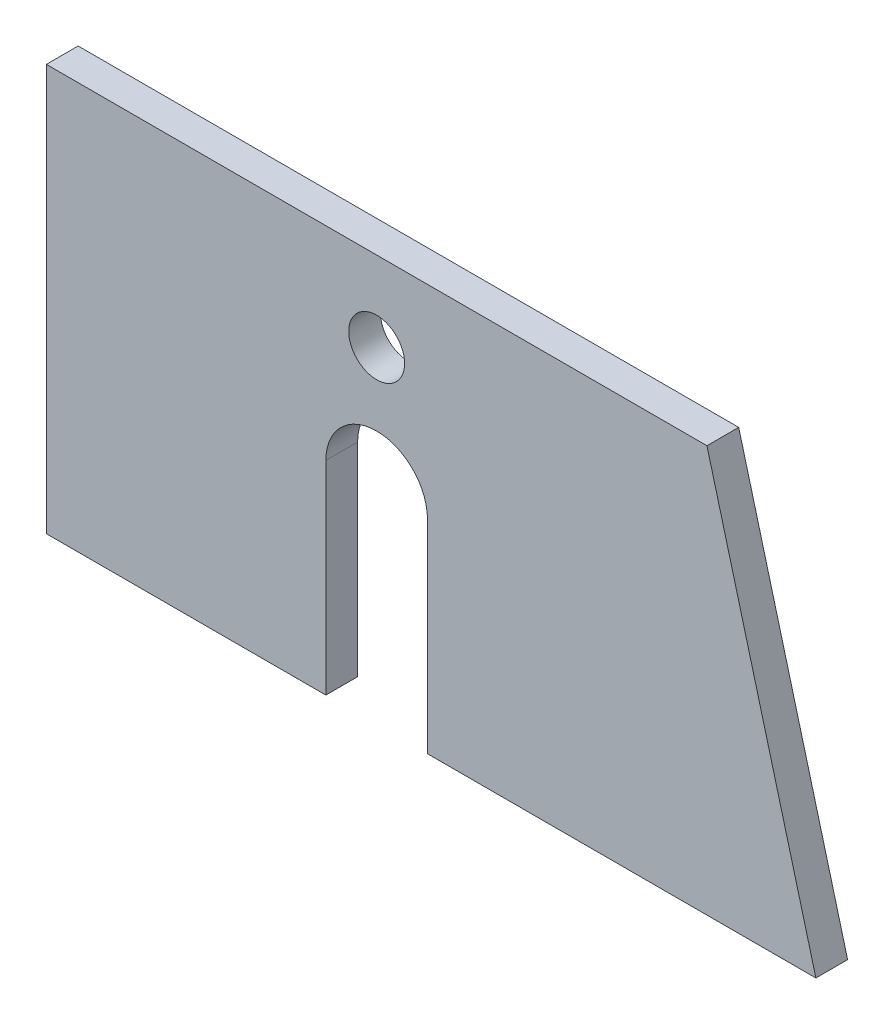
ISO-10303-21;
HEADER;
FILE_DESCRIPTION(('STEP AP214'),'2;1');
FILE_NAME('part.step','',(''),(''),'','','');
FILE_SCHEMA(('AUTOMOTIVE_DESIGN { 1 0 10303 214 1 1 1 1 }'));
ENDSEC;
DATA;
#1=APPLICATION_CONTEXT('core data for automotive mechanical design processes');
#2=APPLICATION_PROTOCOL_DEFINITION('international standard','automotive_design',2000,#1);
#3=PRODUCT_CONTEXT('',#1,'mechanical');
#4=PRODUCT('Part','Part','',(#3));
#5=PRODUCT_RELATED_PRODUCT_CATEGORY('part','',(#4));
#6=PRODUCT_DEFINITION_FORMATION('','',#4);
#7=PRODUCT_DEFINITION_CONTEXT('part definition',#1,'design');
#8=PRODUCT_DEFINITION('design','',#6,#7);
#9=PRODUCT_DEFINITION_SHAPE('','',#8);
#10=(LENGTH_UNIT() NAMED_UNIT(*) SI_UNIT(.MILLI.,.METRE.));
#11=(NAMED_UNIT(*) PLANE_ANGLE_UNIT() SI_UNIT($,.RADIAN.));
#12=(NAMED_UNIT(*) SI_UNIT($,.STERADIAN.) SOLID_ANGLE_UNIT());
#13=UNCERTAINTY_MEASURE_WITH_UNIT(LENGTH_MEASURE(1.E-05),#10,'distance_accuracy_value','');
#14=(GEOMETRIC_REPRESENTATION_CONTEXT(3) GLOBAL_UNCERTAINTY_ASSIGNED_CONTEXT((#13)) GLOBAL_UNIT_ASSIGNED_CONTEXT((#10,
#11,#12)) REPRESENTATION_CONTEXT('',''));
#15=CARTESIAN_POINT('',(0.,0.,0.));
#16=DIRECTION('',(0.,0.,1.));
#17=DIRECTION('',(1.,0.,0.));
#18=AXIS2_PLACEMENT_3D('',#15,#16,#17);
#19=CARTESIAN_POINT('',(0.,0.,3.125));
#20=DIRECTION('',(0.,0.,1.));
#21=DIRECTION('',(1.,0.,0.));
#22=AXIS2_PLACEMENT_3D('',#19,#20,#21);
#23=PLANE('',#22);
#24=DIRECTION('',(0.,-1.,0.));
#25=VECTOR('',#24,1.);
#26=CARTESIAN_POINT('',(-32.5,20.,3.125));
#27=LINE('',#26,#25);
#28=CARTESIAN_POINT('',(-32.5,20.,3.125));
#29=VERTEX_POINT('',#28);
#30=CARTESIAN_POINT('',(-32.5,-20.,3.125));
#31=VERTEX_POINT('',#30);
#32=EDGE_CURVE('E153',#29,#31,#27,.T.);
#33=ORIENTED_EDGE('',*,*,#32,.T.);
#34=DIRECTION('',(1.,0.,0.));
#35=VECTOR('',#34,1.);
#36=CARTESIAN_POINT('',(-32.5,-20.,3.125));
#37=LINE('',#36,#35);
#38=CARTESIAN_POINT('',(-5.,-20.,3.125));
#39=VERTEX_POINT('',#38);
#40=EDGE_CURVE('E101',#31,#39,#37,.T.);
#41=ORIENTED_EDGE('',*,*,#40,.T.);
#42=DIRECTION('',(0.,1.,0.));
#43=VECTOR('',#42,1.);
#44=CARTESIAN_POINT('',(-5.,0.,3.125));
#45=LINE('',#44,#43);
#46=CARTESIAN_POINT('',(-5.,0.,3.125));
#47=VERTEX_POINT('',#46);
#48=EDGE_CURVE('E168',#39,#47,#45,.T.);
#49=ORIENTED_EDGE('',*,*,#48,.T.);
#50=CARTESIAN_POINT('',(0.,0.,3.125));
#51=DIRECTION('',(0.,0.,-1.));
#52=DIRECTION('',(1.,0.,0.));
#53=AXIS2_PLACEMENT_3D('',#50,#51,#52);
#54=CIRCLE('',#53,5.);
#55=CARTESIAN_POINT('',(5.,0.,3.125));
#56=VERTEX_POINT('',#55);
#57=EDGE_CURVE('E181',#47,#56,#54,.T.);
#58=ORIENTED_EDGE('',*,*,#57,.T.);
#59=DIRECTION('',(0.,-1.,0.));
#60=VECTOR('',#59,1.);
#61=CARTESIAN_POINT('',(5.,0.,3.125));
#62=LINE('',#61,#60);
#63=CARTESIAN_POINT('',(5.,-20.,3.125));
#64=VERTEX_POINT('',#63);
#65=EDGE_CURVE('E120',#56,#64,#62,.T.);
#66=ORIENTED_EDGE('',*,*,#65,.T.);
#67=DIRECTION('',(1.,0.,0.));
#68=VECTOR('',#67,1.);
#69=CARTESIAN_POINT('',(5.,-20.,3.125));
#70=LINE('',#69,#68);
#71=CARTESIAN_POINT('',(43.2179676972451,-20.,3.125));
#72=VERTEX_POINT('',#71);
#73=EDGE_CURVE('E114',#64,#72,#70,.T.);
#74=ORIENTED_EDGE('',*,*,#73,.T.);
#75=DIRECTION('',(-0.258819045102525,0.965925826289067,0.));
#76=VECTOR('',#75,1.);
#77=CARTESIAN_POINT('',(32.5,20.,3.125));
#78=LINE('',#77,#76);
#79=CARTESIAN_POINT('',(32.5,20.,3.125));
#80=VERTEX_POINT('',#79);
#81=EDGE_CURVE('E118',#72,#80,#78,.T.);
#82=ORIENTED_EDGE('',*,*,#81,.T.);
#83=DIRECTION('',(-1.,0.,0.));
#84=VECTOR('',#83,1.);
#85=CARTESIAN_POINT('',(-32.5,20.,3.125));
#86=LINE('',#85,#84);
#87=EDGE_CURVE('E58',#80,#29,#86,.T.);
#88=ORIENTED_EDGE('',*,*,#87,.T.);
#89=EDGE_LOOP('',(#33,#41,#49,#58,#66,#74,#82,#88));
#90=FACE_BOUND('',#89,.T.);
#91=CARTESIAN_POINT('',(0.,12.125,3.125));
#92=DIRECTION('',(0.,0.,1.));
#93=DIRECTION('',(1.,0.,0.));
#94=AXIS2_PLACEMENT_3D('',#91,#92,#93);
#95=CIRCLE('',#94,2.75);
#96=CARTESIAN_POINT('',(2.75,12.125,3.125));
#97=VERTEX_POINT('',#96);
#98=EDGE_CURVE('E142',#97,#97,#95,.T.);
#99=ORIENTED_EDGE('',*,*,#98,.F.);
#100=EDGE_LOOP('',(#99));
#101=FACE_BOUND('',#100,.T.);
#102=ADVANCED_FACE('F41',(#90,#101),#23,.T.);
#103=CARTESIAN_POINT('',(0.,0.,0.));
#104=DIRECTION('',(0.,0.,1.));
#105=DIRECTION('',(1.,0.,0.));
#106=AXIS2_PLACEMENT_3D('',#103,#104,#105);
#107=PLANE('',#106);
#108=DIRECTION('',(0.,-1.,0.));
#109=VECTOR('',#108,1.);
#110=CARTESIAN_POINT('',(-32.5,20.,0.));
#111=LINE('',#110,#109);
#112=CARTESIAN_POINT('',(-32.5,20.,0.));
#113=VERTEX_POINT('',#112);
#114=CARTESIAN_POINT('',(-32.5,-20.,0.));
#115=VERTEX_POINT('',#114);
#116=EDGE_CURVE('E138',#113,#115,#111,.T.);
#117=ORIENTED_EDGE('',*,*,#116,.F.);
#118=DIRECTION('',(-1.,0.,0.));
#119=VECTOR('',#118,1.);
#120=CARTESIAN_POINT('',(-32.5,20.,0.));
#121=LINE('',#120,#119);
#122=CARTESIAN_POINT('',(32.5,20.,0.));
#123=VERTEX_POINT('',#122);
#124=EDGE_CURVE('E93',#123,#113,#121,.T.);
#125=ORIENTED_EDGE('',*,*,#124,.F.);
#126=DIRECTION('',(-0.258819045102525,0.965925826289067,0.));
#127=VECTOR('',#126,1.);
#128=CARTESIAN_POINT('',(32.5,20.,0.));
#129=LINE('',#128,#127);
#130=CARTESIAN_POINT('',(43.2179676972451,-20.,0.));
#131=VERTEX_POINT('',#130);
#132=EDGE_CURVE('E87',#131,#123,#129,.T.);
#133=ORIENTED_EDGE('',*,*,#132,.F.);
#134=DIRECTION('',(1.,0.,0.));
#135=VECTOR('',#134,1.);
#136=CARTESIAN_POINT('',(5.,-20.,0.));
#137=LINE('',#136,#135);
#138=CARTESIAN_POINT('',(5.,-20.,0.));
#139=VERTEX_POINT('',#138);
#140=EDGE_CURVE('E128',#139,#131,#137,.T.);
#141=ORIENTED_EDGE('',*,*,#140,.F.);
#142=DIRECTION('',(0.,-1.,0.));
#143=VECTOR('',#142,1.);
#144=CARTESIAN_POINT('',(5.,0.,0.));
#145=LINE('',#144,#143);
#146=CARTESIAN_POINT('',(5.,0.,0.));
#147=VERTEX_POINT('',#146);
#148=EDGE_CURVE('E148',#147,#139,#145,.T.);
#149=ORIENTED_EDGE('',*,*,#148,.F.);
#150=CARTESIAN_POINT('',(0.,0.,0.));
#151=DIRECTION('',(0.,0.,-1.));
#152=DIRECTION('',(1.,0.,0.));
#153=AXIS2_PLACEMENT_3D('',#150,#151,#152);
#154=CIRCLE('',#153,5.);
#155=CARTESIAN_POINT('',(-5.,0.,0.));
#156=VERTEX_POINT('',#155);
#157=EDGE_CURVE('E146',#156,#147,#154,.T.);
#158=ORIENTED_EDGE('',*,*,#157,.F.);
#159=DIRECTION('',(0.,1.,0.));
#160=VECTOR('',#159,1.);
#161=CARTESIAN_POINT('',(-5.,0.,0.));
#162=LINE('',#161,#160);
#163=CARTESIAN_POINT('',(-5.,-20.,0.));
#164=VERTEX_POINT('',#163);
#165=EDGE_CURVE('E144',#164,#156,#162,.T.);
#166=ORIENTED_EDGE('',*,*,#165,.F.);
#167=DIRECTION('',(1.,0.,0.));
#168=VECTOR('',#167,1.);
#169=CARTESIAN_POINT('',(-32.5,-20.,0.));
#170=LINE('',#169,#168);
#171=EDGE_CURVE('E141',#115,#164,#170,.T.);
#172=ORIENTED_EDGE('',*,*,#171,.F.);
#173=EDGE_LOOP('',(#117,#125,#133,#141,#149,#158,#166,#172));
#174=FACE_BOUND('',#173,.T.);
#175=CARTESIAN_POINT('',(0.,12.125,0.));
#176=DIRECTION('',(0.,0.,1.));
#177=DIRECTION('',(1.,0.,0.));
#178=AXIS2_PLACEMENT_3D('',#175,#176,#177);
#179=CIRCLE('',#178,2.75);
#180=CARTESIAN_POINT('',(2.75,12.125,0.));
#181=VERTEX_POINT('',#180);
#182=EDGE_CURVE('E187',#181,#181,#179,.T.);
#183=ORIENTED_EDGE('',*,*,#182,.T.);
#184=EDGE_LOOP('',(#183));
#185=FACE_BOUND('',#184,.T.);
#186=ADVANCED_FACE('F172',(#174,#185),#107,.F.);
#187=CARTESIAN_POINT('',(-32.5,20.,3.125));
#188=DIRECTION('',(1.,0.,0.));
#189=DIRECTION('',(0.,1.,0.));
#190=AXIS2_PLACEMENT_3D('',#187,#188,#189);
#191=PLANE('',#190);
#192=ORIENTED_EDGE('',*,*,#116,.T.);
#193=DIRECTION('',(0.,0.,-1.));
#194=VECTOR('',#193,1.);
#195=CARTESIAN_POINT('',(-32.5,-20.,3.125));
#196=LINE('',#195,#194);
#197=EDGE_CURVE('E11',#31,#115,#196,.T.);
#198=ORIENTED_EDGE('',*,*,#197,.F.);
#199=ORIENTED_EDGE('',*,*,#32,.F.);
#200=DIRECTION('',(0.,0.,-1.));
#201=VECTOR('',#200,1.);
#202=CARTESIAN_POINT('',(-32.5,20.,3.125));
#203=LINE('',#202,#201);
#204=EDGE_CURVE('E134',#29,#113,#203,.T.);
#205=ORIENTED_EDGE('',*,*,#204,.T.);
#206=EDGE_LOOP('',(#192,#198,#199,#205));
#207=FACE_BOUND('',#206,.T.);
#208=ADVANCED_FACE('F43',(#207),#191,.F.);
#209=CARTESIAN_POINT('',(-32.5,-20.,3.125));
#210=DIRECTION('',(0.,1.,0.));
#211=DIRECTION('',(-1.,0.,0.));
#212=AXIS2_PLACEMENT_3D('',#209,#210,#211);
#213=PLANE('',#212);
#214=ORIENTED_EDGE('',*,*,#171,.T.);
#215=DIRECTION('',(0.,0.,-1.));
#216=VECTOR('',#215,1.);
#217=CARTESIAN_POINT('',(-5.,-20.,3.125));
#218=LINE('',#217,#216);
#219=EDGE_CURVE('E50',#39,#164,#218,.T.);
#220=ORIENTED_EDGE('',*,*,#219,.F.);
#221=ORIENTED_EDGE('',*,*,#40,.F.);
#222=ORIENTED_EDGE('',*,*,#197,.T.);
#223=EDGE_LOOP('',(#214,#220,#221,#222));
#224=FACE_BOUND('',#223,.T.);
#225=ADVANCED_FACE('F215',(#224),#213,.F.);
#226=CARTESIAN_POINT('',(-5.,0.,3.125));
#227=DIRECTION('',(-1.,0.,0.));
#228=DIRECTION('',(0.,-1.,0.));
#229=AXIS2_PLACEMENT_3D('',#226,#227,#228);
#230=PLANE('',#229);
#231=ORIENTED_EDGE('',*,*,#165,.T.);
#232=DIRECTION('',(0.,0.,-1.));
#233=VECTOR('',#232,1.);
#234=CARTESIAN_POINT('',(-5.,0.,3.125));
#235=LINE('',#234,#233);
#236=EDGE_CURVE('E160',#47,#156,#235,.T.);
#237=ORIENTED_EDGE('',*,*,#236,.F.);
#238=ORIENTED_EDGE('',*,*,#48,.F.);
#239=ORIENTED_EDGE('',*,*,#219,.T.);
#240=EDGE_LOOP('',(#231,#237,#238,#239));
#241=FACE_BOUND('',#240,.T.);
#242=ADVANCED_FACE('F166',(#241),#230,.F.);
#243=CARTESIAN_POINT('',(0.,0.,3.125));
#244=DIRECTION('',(0.,0.,-1.));
#245=DIRECTION('',(-1.,0.,0.));
#246=AXIS2_PLACEMENT_3D('',#243,#244,#245);
#247=CYLINDRICAL_SURFACE('',#246,5.);
#248=ORIENTED_EDGE('',*,*,#157,.T.);
#249=DIRECTION('',(0.,0.,-1.));
#250=VECTOR('',#249,1.);
#251=CARTESIAN_POINT('',(5.,0.,3.125));
#252=LINE('',#251,#250);
#253=EDGE_CURVE('E157',#56,#147,#252,.T.);
#254=ORIENTED_EDGE('',*,*,#253,.F.);
#255=ORIENTED_EDGE('',*,*,#57,.F.);
#256=ORIENTED_EDGE('',*,*,#236,.T.);
#257=EDGE_LOOP('',(#248,#254,#255,#256));
#258=FACE_BOUND('',#257,.T.);
#259=ADVANCED_FACE('F177',(#258),#247,.F.);
#260=CARTESIAN_POINT('',(5.,0.,3.125));
#261=DIRECTION('',(1.,0.,0.));
#262=DIRECTION('',(0.,1.,0.));
#263=AXIS2_PLACEMENT_3D('',#260,#261,#262);
#264=PLANE('',#263);
#265=ORIENTED_EDGE('',*,*,#148,.T.);
#266=DIRECTION('',(0.,0.,-1.));
#267=VECTOR('',#266,1.);
#268=CARTESIAN_POINT('',(5.,-20.,3.125));
#269=LINE('',#268,#267);
#270=EDGE_CURVE('E129',#64,#139,#269,.T.);
#271=ORIENTED_EDGE('',*,*,#270,.F.);
#272=ORIENTED_EDGE('',*,*,#65,.F.);
#273=ORIENTED_EDGE('',*,*,#253,.T.);
#274=EDGE_LOOP('',(#265,#271,#272,#273));
#275=FACE_BOUND('',#274,.T.);
#276=ADVANCED_FACE('F180',(#275),#264,.F.);
#277=CARTESIAN_POINT('',(5.,-20.,3.125));
#278=DIRECTION('',(0.,1.,0.));
#279=DIRECTION('',(-1.,0.,0.));
#280=AXIS2_PLACEMENT_3D('',#277,#278,#279);
#281=PLANE('',#280);
#282=ORIENTED_EDGE('',*,*,#140,.T.);
#283=DIRECTION('',(0.,0.,-1.));
#284=VECTOR('',#283,1.);
#285=CARTESIAN_POINT('',(43.2179676972451,-20.,3.125));
#286=LINE('',#285,#284);
#287=EDGE_CURVE('E125',#72,#131,#286,.T.);
#288=ORIENTED_EDGE('',*,*,#287,.F.);
#289=ORIENTED_EDGE('',*,*,#73,.F.);
#290=ORIENTED_EDGE('',*,*,#270,.T.);
#291=EDGE_LOOP('',(#282,#288,#289,#290));
#292=FACE_BOUND('',#291,.T.);
#293=ADVANCED_FACE('F126',(#292),#281,.F.);
#294=CARTESIAN_POINT('',(32.5,20.,3.125));
#295=DIRECTION('',(-0.965925826289067,-0.258819045102525,0.));
#296=DIRECTION('',(0.258819045102525,-0.965925826289067,0.));
#297=AXIS2_PLACEMENT_3D('',#294,#295,#296);
#298=PLANE('',#297);
#299=ORIENTED_EDGE('',*,*,#132,.T.);
#300=DIRECTION('',(0.,0.,-1.));
#301=VECTOR('',#300,1.);
#302=CARTESIAN_POINT('',(32.5,20.,3.125));
#303=LINE('',#302,#301);
#304=EDGE_CURVE('E130',#80,#123,#303,.T.);
#305=ORIENTED_EDGE('',*,*,#304,.F.);
#306=ORIENTED_EDGE('',*,*,#81,.F.);
#307=ORIENTED_EDGE('',*,*,#287,.T.);
#308=EDGE_LOOP('',(#299,#305,#306,#307));
#309=FACE_BOUND('',#308,.T.);
#310=ADVANCED_FACE('F132',(#309),#298,.F.);
#311=CARTESIAN_POINT('',(-32.5,20.,3.125));
#312=DIRECTION('',(0.,-1.,0.));
#313=DIRECTION('',(0.,0.,-1.));
#314=AXIS2_PLACEMENT_3D('',#311,#312,#313);
#315=PLANE('',#314);
#316=ORIENTED_EDGE('',*,*,#124,.T.);
#317=ORIENTED_EDGE('',*,*,#204,.F.);
#318=ORIENTED_EDGE('',*,*,#87,.F.);
#319=ORIENTED_EDGE('',*,*,#304,.T.);
#320=EDGE_LOOP('',(#316,#317,#318,#319));
#321=FACE_BOUND('',#320,.T.);
#322=ADVANCED_FACE('F203',(#321),#315,.F.);
#323=CARTESIAN_POINT('',(0.,12.125,3.125));
#324=DIRECTION('',(0.,0.,-1.));
#325=DIRECTION('',(-1.,0.,0.));
#326=AXIS2_PLACEMENT_3D('',#323,#324,#325);
#327=CYLINDRICAL_SURFACE('',#326,2.75);
#328=ORIENTED_EDGE('',*,*,#98,.T.);
#329=EDGE_LOOP('',(#328));
#330=FACE_BOUND('',#329,.T.);
#331=ORIENTED_EDGE('',*,*,#182,.F.);
#332=EDGE_LOOP('',(#331));
#333=FACE_BOUND('',#332,.T.);
#334=ADVANCED_FACE('F193',(#330,#333),#327,.F.);
#335=CLOSED_SHELL('',(#102,#186,#208,#225,#242,#259,#276,#293,#310,#322,#334));
#336=MANIFOLD_SOLID_BREP('B2',#335);
#337=ADVANCED_BREP_SHAPE_REPRESENTATION('',(#18,#336),#14);
#338=SHAPE_DEFINITION_REPRESENTATION(#9,#337);
ENDSEC;
END-ISO-10303-21;
